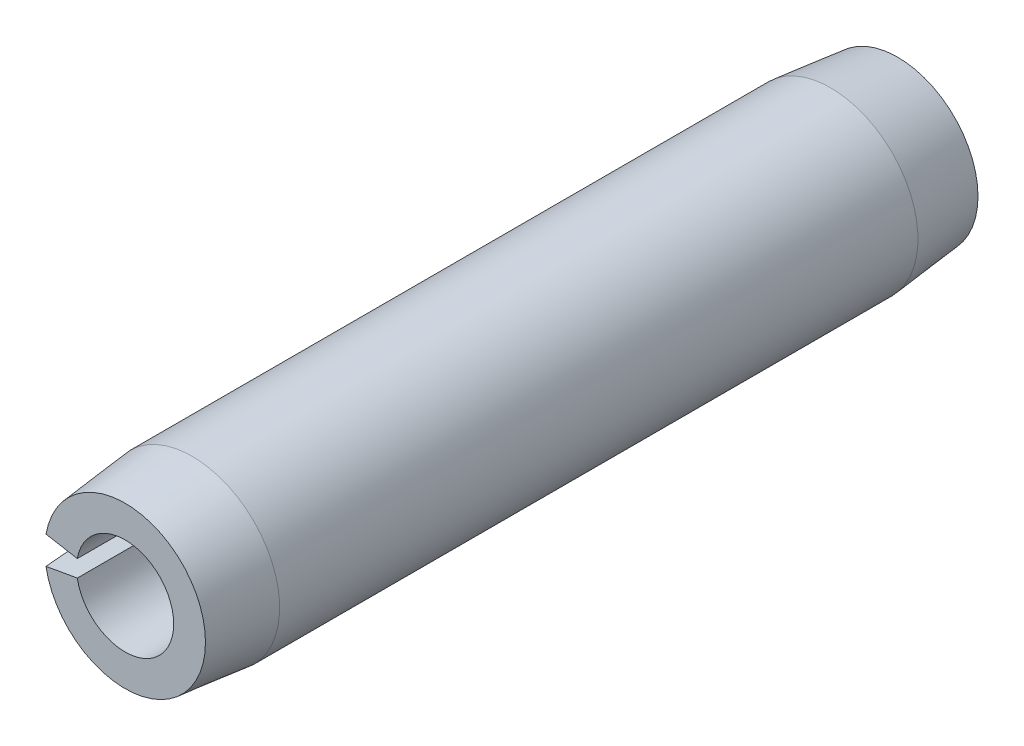
ISO-10303-21;
HEADER;
FILE_DESCRIPTION(('STEP AP214'),'2;1');
FILE_NAME('part.step','',(''),(''),'','','');
FILE_SCHEMA(('AUTOMOTIVE_DESIGN { 1 0 10303 214 1 1 1 1 }'));
ENDSEC;
DATA;
#1=APPLICATION_CONTEXT('core data for automotive mechanical design processes');
#2=APPLICATION_PROTOCOL_DEFINITION('international standard','automotive_design',2000,#1);
#3=PRODUCT_CONTEXT('',#1,'mechanical');
#4=PRODUCT('Part','Part','',(#3));
#5=PRODUCT_RELATED_PRODUCT_CATEGORY('part','',(#4));
#6=PRODUCT_DEFINITION_FORMATION('','',#4);
#7=PRODUCT_DEFINITION_CONTEXT('part definition',#1,'design');
#8=PRODUCT_DEFINITION('design','',#6,#7);
#9=PRODUCT_DEFINITION_SHAPE('','',#8);
#10=(LENGTH_UNIT() NAMED_UNIT(*) SI_UNIT(.MILLI.,.METRE.));
#11=(NAMED_UNIT(*) PLANE_ANGLE_UNIT() SI_UNIT($,.RADIAN.));
#12=(NAMED_UNIT(*) SI_UNIT($,.STERADIAN.) SOLID_ANGLE_UNIT());
#13=UNCERTAINTY_MEASURE_WITH_UNIT(LENGTH_MEASURE(1.E-05),#10,'distance_accuracy_value','');
#14=(GEOMETRIC_REPRESENTATION_CONTEXT(3) GLOBAL_UNCERTAINTY_ASSIGNED_CONTEXT((#13)) GLOBAL_UNIT_ASSIGNED_CONTEXT((#10,
#11,#12)) REPRESENTATION_CONTEXT('',''));
#15=CARTESIAN_POINT('',(0.,0.,0.));
#16=DIRECTION('',(0.,0.,1.));
#17=DIRECTION('',(1.,0.,0.));
#18=AXIS2_PLACEMENT_3D('',#15,#16,#17);
#19=CARTESIAN_POINT('',(0.,0.,5.55625));
#20=DIRECTION('',(0.,0.,-1.));
#21=DIRECTION('',(-1.,0.,0.));
#22=AXIS2_PLACEMENT_3D('',#19,#20,#21);
#23=CYLINDRICAL_SURFACE('',#22,0.6985);
#24=CARTESIAN_POINT('',(0.,0.,-5.55625));
#25=DIRECTION('',(0.,0.,-1.));
#26=DIRECTION('',(1.,0.,0.));
#27=AXIS2_PLACEMENT_3D('',#24,#25,#26);
#28=CIRCLE('',#27,0.6985);
#29=CARTESIAN_POINT('',(-0.687888215479028,0.121293252100349,-5.55625));
#30=VERTEX_POINT('',#29);
#31=CARTESIAN_POINT('',(-0.687888215479028,-0.121293252100349,-5.55625));
#32=VERTEX_POINT('',#31);
#33=EDGE_CURVE('E129',#30,#32,#28,.T.);
#34=ORIENTED_EDGE('',*,*,#33,.T.);
#35=DIRECTION('',(0.,0.,-1.));
#36=VECTOR('',#35,1.);
#37=CARTESIAN_POINT('',(-0.687888215479028,-0.121293252100349,5.55625));
#38=LINE('',#37,#36);
#39=CARTESIAN_POINT('',(-0.687888215479028,-0.121293252100349,5.55625));
#40=VERTEX_POINT('',#39);
#41=EDGE_CURVE('E13',#40,#32,#38,.T.);
#42=ORIENTED_EDGE('',*,*,#41,.F.);
#43=CARTESIAN_POINT('',(0.,0.,5.55625));
#44=DIRECTION('',(0.,0.,-1.));
#45=DIRECTION('',(1.,0.,0.));
#46=AXIS2_PLACEMENT_3D('',#43,#44,#45);
#47=CIRCLE('',#46,0.6985);
#48=CARTESIAN_POINT('',(-0.687888215479028,0.121293252100349,5.55625));
#49=VERTEX_POINT('',#48);
#50=EDGE_CURVE('E125',#49,#40,#47,.T.);
#51=ORIENTED_EDGE('',*,*,#50,.F.);
#52=DIRECTION('',(0.,0.,-1.));
#53=VECTOR('',#52,1.);
#54=CARTESIAN_POINT('',(-0.687888215479028,0.121293252100349,5.55625));
#55=LINE('',#54,#53);
#56=EDGE_CURVE('E118',#49,#30,#55,.T.);
#57=ORIENTED_EDGE('',*,*,#56,.T.);
#58=EDGE_LOOP('',(#34,#42,#51,#57));
#59=FACE_BOUND('',#58,.T.);
#60=ADVANCED_FACE('F46',(#59),#23,.F.);
#61=CARTESIAN_POINT('',(-0.687888215479028,-0.121293252100349,5.55625));
#62=DIRECTION('',(0.173648177666927,-0.984807753012209,0.));
#63=DIRECTION('',(0.984807753012209,0.173648177666927,0.));
#64=AXIS2_PLACEMENT_3D('',#61,#62,#63);
#65=PLANE('',#64);
#66=DIRECTION('',(0.,0.,-1.));
#67=VECTOR('',#66,1.);
#68=CARTESIAN_POINT('',(-1.23819878786225,-0.218327853780627,5.55625));
#69=LINE('',#68,#67);
#70=CARTESIAN_POINT('',(-1.23819878786225,-0.218327853780628,4.59105));
#71=VERTEX_POINT('',#70);
#72=CARTESIAN_POINT('',(-1.23819878786225,-0.218327853780628,-4.59105));
#73=VERTEX_POINT('',#72);
#74=EDGE_CURVE('E53',#71,#73,#69,.T.);
#75=ORIENTED_EDGE('',*,*,#74,.F.);
#76=DIRECTION('',(-0.103094387415781,-0.0181783220610131,-0.994505452921406));
#77=VECTOR('',#76,1.);
#78=CARTESIAN_POINT('',(0.,0.,16.5354));
#79=LINE('',#78,#77);
#80=CARTESIAN_POINT('',(-1.13814232015621,-0.200685198929668,5.55625));
#81=VERTEX_POINT('',#80);
#82=EDGE_CURVE('E100',#71,#81,#79,.F.);
#83=ORIENTED_EDGE('',*,*,#82,.T.);
#84=DIRECTION('',(-0.984807753012209,-0.173648177666927,0.));
#85=VECTOR('',#84,1.);
#86=CARTESIAN_POINT('',(-0.687888215479028,-0.121293252100349,5.55625));
#87=LINE('',#86,#85);
#88=EDGE_CURVE('E133',#40,#81,#87,.T.);
#89=ORIENTED_EDGE('',*,*,#88,.F.);
#90=ORIENTED_EDGE('',*,*,#41,.T.);
#91=DIRECTION('',(-0.984807753012209,-0.173648177666927,0.));
#92=VECTOR('',#91,1.);
#93=CARTESIAN_POINT('',(-0.687888215479028,-0.121293252100349,-5.55625));
#94=LINE('',#93,#92);
#95=CARTESIAN_POINT('',(-1.13814232015621,-0.200685198929668,-5.55625));
#96=VERTEX_POINT('',#95);
#97=EDGE_CURVE('E126',#32,#96,#94,.T.);
#98=ORIENTED_EDGE('',*,*,#97,.T.);
#99=DIRECTION('',(0.103094387415781,0.0181783220610131,-0.994505452921406));
#100=VECTOR('',#99,1.);
#101=CARTESIAN_POINT('',(0.,0.,-16.5354));
#102=LINE('',#101,#100);
#103=EDGE_CURVE('E68',#96,#73,#102,.F.);
#104=ORIENTED_EDGE('',*,*,#103,.T.);
#105=EDGE_LOOP('',(#75,#83,#89,#90,#98,#104));
#106=FACE_BOUND('',#105,.T.);
#107=ADVANCED_FACE('F147',(#106),#65,.F.);
#108=CARTESIAN_POINT('',(0.,0.,5.55625));
#109=DIRECTION('',(0.,0.,-1.));
#110=DIRECTION('',(-1.,0.,0.));
#111=AXIS2_PLACEMENT_3D('',#108,#109,#110);
#112=CYLINDRICAL_SURFACE('',#111,1.2573);
#113=DIRECTION('',(0.,0.,-1.));
#114=VECTOR('',#113,1.);
#115=CARTESIAN_POINT('',(-1.23819878786225,0.218327853780628,5.55625));
#116=LINE('',#115,#114);
#117=CARTESIAN_POINT('',(-1.23819878786225,0.218327853780628,4.59105));
#118=VERTEX_POINT('',#117);
#119=CARTESIAN_POINT('',(-1.23819878786225,0.218327853780628,-4.59105));
#120=VERTEX_POINT('',#119);
#121=EDGE_CURVE('E110',#118,#120,#116,.T.);
#122=ORIENTED_EDGE('',*,*,#121,.F.);
#123=CARTESIAN_POINT('',(0.,0.,4.59105));
#124=DIRECTION('',(0.,0.,-1.));
#125=DIRECTION('',(-1.,0.,0.));
#126=AXIS2_PLACEMENT_3D('',#123,#124,#125);
#127=CIRCLE('',#126,1.2573);
#128=EDGE_CURVE('E97',#118,#71,#127,.T.);
#129=ORIENTED_EDGE('',*,*,#128,.T.);
#130=ORIENTED_EDGE('',*,*,#74,.T.);
#131=CARTESIAN_POINT('',(0.,0.,-4.59105));
#132=DIRECTION('',(0.,0.,-1.));
#133=DIRECTION('',(-1.,0.,0.));
#134=AXIS2_PLACEMENT_3D('',#131,#132,#133);
#135=CIRCLE('',#134,1.2573);
#136=EDGE_CURVE('E117',#120,#73,#135,.T.);
#137=ORIENTED_EDGE('',*,*,#136,.F.);
#138=EDGE_LOOP('',(#122,#129,#130,#137));
#139=FACE_BOUND('',#138,.T.);
#140=ADVANCED_FACE('F116',(#139),#112,.T.);
#141=CARTESIAN_POINT('',(-1.23819878786225,0.218327853780628,5.55625));
#142=DIRECTION('',(0.173648177666927,0.984807753012209,0.));
#143=DIRECTION('',(-0.984807753012209,0.173648177666927,0.));
#144=AXIS2_PLACEMENT_3D('',#141,#142,#143);
#145=PLANE('',#144);
#146=DIRECTION('',(0.984807753012209,-0.173648177666927,0.));
#147=VECTOR('',#146,1.);
#148=CARTESIAN_POINT('',(-1.23819878786225,0.218327853780628,5.55625));
#149=LINE('',#148,#147);
#150=CARTESIAN_POINT('',(-1.13814232015621,0.200685198929668,5.55625));
#151=VERTEX_POINT('',#150);
#152=EDGE_CURVE('E113',#151,#49,#149,.T.);
#153=ORIENTED_EDGE('',*,*,#152,.F.);
#154=DIRECTION('',(0.103094387415781,-0.0181783220610131,0.994505452921406));
#155=VECTOR('',#154,1.);
#156=CARTESIAN_POINT('',(0.,0.,16.5354));
#157=LINE('',#156,#155);
#158=EDGE_CURVE('E60',#151,#118,#157,.F.);
#159=ORIENTED_EDGE('',*,*,#158,.T.);
#160=ORIENTED_EDGE('',*,*,#121,.T.);
#161=DIRECTION('',(-0.103094387415781,0.0181783220610131,0.994505452921406));
#162=VECTOR('',#161,1.);
#163=CARTESIAN_POINT('',(0.,0.,-16.5354));
#164=LINE('',#163,#162);
#165=CARTESIAN_POINT('',(-1.13814232015621,0.200685198929668,-5.55625));
#166=VERTEX_POINT('',#165);
#167=EDGE_CURVE('E139',#120,#166,#164,.F.);
#168=ORIENTED_EDGE('',*,*,#167,.T.);
#169=DIRECTION('',(0.984807753012209,-0.173648177666927,0.));
#170=VECTOR('',#169,1.);
#171=CARTESIAN_POINT('',(-1.23819878786225,0.218327853780628,-5.55625));
#172=LINE('',#171,#170);
#173=EDGE_CURVE('E123',#166,#30,#172,.T.);
#174=ORIENTED_EDGE('',*,*,#173,.T.);
#175=ORIENTED_EDGE('',*,*,#56,.F.);
#176=EDGE_LOOP('',(#153,#159,#160,#168,#174,#175));
#177=FACE_BOUND('',#176,.T.);
#178=ADVANCED_FACE('F108',(#177),#145,.F.);
#179=CARTESIAN_POINT('',(0.,0.,5.55625));
#180=DIRECTION('',(0.,0.,1.));
#181=DIRECTION('',(1.,0.,0.));
#182=AXIS2_PLACEMENT_3D('',#179,#180,#181);
#183=PLANE('',#182);
#184=CARTESIAN_POINT('',(0.,0.,5.55625));
#185=DIRECTION('',(0.,0.,-1.));
#186=DIRECTION('',(-1.,0.,0.));
#187=AXIS2_PLACEMENT_3D('',#184,#185,#186);
#188=CIRCLE('',#187,1.1557);
#189=EDGE_CURVE('E104',#151,#81,#188,.T.);
#190=ORIENTED_EDGE('',*,*,#189,.F.);
#191=ORIENTED_EDGE('',*,*,#152,.T.);
#192=ORIENTED_EDGE('',*,*,#50,.T.);
#193=ORIENTED_EDGE('',*,*,#88,.T.);
#194=EDGE_LOOP('',(#190,#191,#192,#193));
#195=FACE_BOUND('',#194,.T.);
#196=ADVANCED_FACE('F148',(#195),#183,.T.);
#197=CARTESIAN_POINT('',(0.,0.,-5.55625));
#198=DIRECTION('',(0.,0.,1.));
#199=DIRECTION('',(1.,0.,0.));
#200=AXIS2_PLACEMENT_3D('',#197,#198,#199);
#201=PLANE('',#200);
#202=ORIENTED_EDGE('',*,*,#173,.F.);
#203=CARTESIAN_POINT('',(0.,0.,-5.55625));
#204=DIRECTION('',(0.,0.,-1.));
#205=DIRECTION('',(-1.,0.,0.));
#206=AXIS2_PLACEMENT_3D('',#203,#204,#205);
#207=CIRCLE('',#206,1.1557);
#208=EDGE_CURVE('E141',#166,#96,#207,.T.);
#209=ORIENTED_EDGE('',*,*,#208,.T.);
#210=ORIENTED_EDGE('',*,*,#97,.F.);
#211=ORIENTED_EDGE('',*,*,#33,.F.);
#212=EDGE_LOOP('',(#202,#209,#210,#211));
#213=FACE_BOUND('',#212,.T.);
#214=ADVANCED_FACE('F155',(#213),#201,.F.);
#215=CARTESIAN_POINT('',(0.,0.,-4.59105));
#216=DIRECTION('',(0.,0.,1.));
#217=DIRECTION('',(1.,0.,0.));
#218=AXIS2_PLACEMENT_3D('',#215,#216,#217);
#219=CONICAL_SURFACE('',#218,1.2573,0.104876938730234);
#220=ORIENTED_EDGE('',*,*,#208,.F.);
#221=ORIENTED_EDGE('',*,*,#167,.F.);
#222=ORIENTED_EDGE('',*,*,#136,.T.);
#223=ORIENTED_EDGE('',*,*,#103,.F.);
#224=EDGE_LOOP('',(#220,#221,#222,#223));
#225=FACE_BOUND('',#224,.T.);
#226=ADVANCED_FACE('F156',(#225),#219,.T.);
#227=CARTESIAN_POINT('',(0.,0.,5.55625));
#228=DIRECTION('',(0.,0.,-1.));
#229=DIRECTION('',(-1.,0.,0.));
#230=AXIS2_PLACEMENT_3D('',#227,#228,#229);
#231=CONICAL_SURFACE('',#230,1.1557,0.104876938730234);
#232=ORIENTED_EDGE('',*,*,#128,.F.);
#233=ORIENTED_EDGE('',*,*,#158,.F.);
#234=ORIENTED_EDGE('',*,*,#189,.T.);
#235=ORIENTED_EDGE('',*,*,#82,.F.);
#236=EDGE_LOOP('',(#232,#233,#234,#235));
#237=FACE_BOUND('',#236,.T.);
#238=ADVANCED_FACE('F98',(#237),#231,.T.);
#239=CLOSED_SHELL('',(#60,#107,#140,#178,#196,#214,#226,#238));
#240=MANIFOLD_SOLID_BREP('B2',#239);
#241=ADVANCED_BREP_SHAPE_REPRESENTATION('',(#18,#240),#14);
#242=SHAPE_DEFINITION_REPRESENTATION(#9,#241);
ENDSEC;
END-ISO-10303-21;
